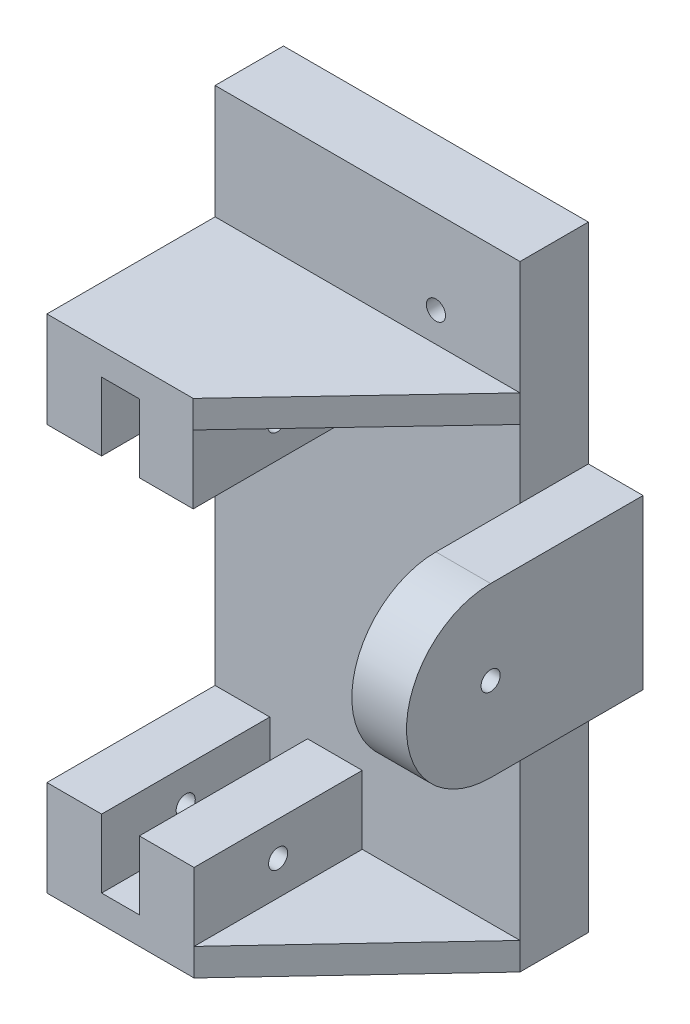
ISO-10303-21;
HEADER;
FILE_DESCRIPTION(('STEP AP214'),'2;1');
FILE_NAME('part.step','',(''),(''),'','','');
FILE_SCHEMA(('AUTOMOTIVE_DESIGN { 1 0 10303 214 1 1 1 1 }'));
ENDSEC;
DATA;
#1=APPLICATION_CONTEXT('core data for automotive mechanical design processes');
#2=APPLICATION_PROTOCOL_DEFINITION('international standard','automotive_design',2000,#1);
#3=PRODUCT_CONTEXT('',#1,'mechanical');
#4=PRODUCT('Part','Part','',(#3));
#5=PRODUCT_RELATED_PRODUCT_CATEGORY('part','',(#4));
#6=PRODUCT_DEFINITION_FORMATION('','',#4);
#7=PRODUCT_DEFINITION_CONTEXT('part definition',#1,'design');
#8=PRODUCT_DEFINITION('design','',#6,#7);
#9=PRODUCT_DEFINITION_SHAPE('','',#8);
#10=(LENGTH_UNIT() NAMED_UNIT(*) SI_UNIT(.MILLI.,.METRE.));
#11=(NAMED_UNIT(*) PLANE_ANGLE_UNIT() SI_UNIT($,.RADIAN.));
#12=(NAMED_UNIT(*) SI_UNIT($,.STERADIAN.) SOLID_ANGLE_UNIT());
#13=UNCERTAINTY_MEASURE_WITH_UNIT(LENGTH_MEASURE(1.E-05),#10,'distance_accuracy_value','');
#14=(GEOMETRIC_REPRESENTATION_CONTEXT(3) GLOBAL_UNCERTAINTY_ASSIGNED_CONTEXT((#13)) GLOBAL_UNIT_ASSIGNED_CONTEXT((#10,
#11,#12)) REPRESENTATION_CONTEXT('',''));
#15=CARTESIAN_POINT('',(0.,0.,0.));
#16=DIRECTION('',(0.,0.,1.));
#17=DIRECTION('',(1.,0.,0.));
#18=AXIS2_PLACEMENT_3D('',#15,#16,#17);
#19=CARTESIAN_POINT('',(0.,0.,5.));
#20=DIRECTION('',(-1.,0.,0.));
#21=DIRECTION('',(0.,-1.,0.));
#22=AXIS2_PLACEMENT_3D('',#19,#20,#21);
#23=PLANE('',#22);
#24=DIRECTION('',(0.,0.,-1.));
#25=VECTOR('',#24,1.);
#26=CARTESIAN_POINT('',(0.,-27.62,0.));
#27=LINE('',#26,#25);
#28=CARTESIAN_POINT('',(0.,-27.62,5.));
#29=VERTEX_POINT('',#28);
#30=CARTESIAN_POINT('',(0.,-27.62,0.));
#31=VERTEX_POINT('',#30);
#32=EDGE_CURVE('E11',#29,#31,#27,.T.);
#33=ORIENTED_EDGE('',*,*,#32,.F.);
#34=DIRECTION('',(0.,1.,0.));
#35=VECTOR('',#34,1.);
#36=CARTESIAN_POINT('',(0.,0.,5.));
#37=LINE('',#36,#35);
#38=CARTESIAN_POINT('',(0.,-43.,5.));
#39=VERTEX_POINT('',#38);
#40=EDGE_CURVE('E513',#39,#29,#37,.T.);
#41=ORIENTED_EDGE('',*,*,#40,.F.);
#42=DIRECTION('',(0.,1.,0.));
#43=VECTOR('',#42,1.);
#44=CARTESIAN_POINT('',(0.,-45.,5.));
#45=LINE('',#44,#43);
#46=CARTESIAN_POINT('',(0.,-45.,5.));
#47=VERTEX_POINT('',#46);
#48=EDGE_CURVE('E396',#47,#39,#45,.T.);
#49=ORIENTED_EDGE('',*,*,#48,.F.);
#50=DIRECTION('',(0.,0.,1.));
#51=VECTOR('',#50,1.);
#52=CARTESIAN_POINT('',(0.,-45.,5.));
#53=LINE('',#52,#51);
#54=CARTESIAN_POINT('',(0.,-45.,0.));
#55=VERTEX_POINT('',#54);
#56=EDGE_CURVE('E398',#55,#47,#53,.T.);
#57=ORIENTED_EDGE('',*,*,#56,.F.);
#58=DIRECTION('',(0.,1.,0.));
#59=VECTOR('',#58,1.);
#60=CARTESIAN_POINT('',(0.,0.,0.));
#61=LINE('',#60,#59);
#62=EDGE_CURVE('E271',#55,#31,#61,.T.);
#63=ORIENTED_EDGE('',*,*,#62,.T.);
#64=EDGE_LOOP('',(#33,#41,#49,#57,#63));
#65=FACE_BOUND('',#64,.T.);
#66=ADVANCED_FACE('F41',(#65),#23,.F.);
#67=DIRECTION('',(0.,0.,1.));
#68=VECTOR('',#67,1.);
#69=CARTESIAN_POINT('',(0.,-15.32,11.15));
#70=LINE('',#69,#68);
#71=CARTESIAN_POINT('',(0.,-15.32,0.));
#72=VERTEX_POINT('',#71);
#73=CARTESIAN_POINT('',(0.,-15.32,5.));
#74=VERTEX_POINT('',#73);
#75=EDGE_CURVE('E63',#72,#74,#70,.T.);
#76=ORIENTED_EDGE('',*,*,#75,.F.);
#77=CARTESIAN_POINT('',(0.,0.,0.));
#78=VERTEX_POINT('',#77);
#79=EDGE_CURVE('E243',#72,#78,#61,.T.);
#80=ORIENTED_EDGE('',*,*,#79,.T.);
#81=DIRECTION('',(0.,0.,-1.));
#82=VECTOR('',#81,1.);
#83=CARTESIAN_POINT('',(0.,0.,5.));
#84=LINE('',#83,#82);
#85=CARTESIAN_POINT('',(0.,0.,5.));
#86=VERTEX_POINT('',#85);
#87=EDGE_CURVE('E49',#86,#78,#84,.T.);
#88=ORIENTED_EDGE('',*,*,#87,.F.);
#89=CARTESIAN_POINT('',(0.,-8.32,5.));
#90=VERTEX_POINT('',#89);
#91=EDGE_CURVE('E284',#90,#86,#37,.T.);
#92=ORIENTED_EDGE('',*,*,#91,.F.);
#93=DIRECTION('',(0.,-1.,0.));
#94=VECTOR('',#93,1.);
#95=CARTESIAN_POINT('',(0.,-8.32,5.));
#96=LINE('',#95,#94);
#97=CARTESIAN_POINT('',(0.,-10.32,5.));
#98=VERTEX_POINT('',#97);
#99=EDGE_CURVE('E553',#90,#98,#96,.T.);
#100=ORIENTED_EDGE('',*,*,#99,.T.);
#101=EDGE_CURVE('E517',#74,#98,#37,.T.);
#102=ORIENTED_EDGE('',*,*,#101,.F.);
#103=EDGE_LOOP('',(#76,#80,#88,#92,#100,#102));
#104=FACE_BOUND('',#103,.T.);
#105=ADVANCED_FACE('F532',(#104),#23,.F.);
#106=CARTESIAN_POINT('',(0.,0.,5.));
#107=DIRECTION('',(0.,0.,-1.));
#108=DIRECTION('',(-1.,0.,0.));
#109=AXIS2_PLACEMENT_3D('',#106,#107,#108);
#110=PLANE('',#109);
#111=DIRECTION('',(-1.,0.,0.));
#112=VECTOR('',#111,1.);
#113=CARTESIAN_POINT('',(0.,-10.32,5.));
#114=LINE('',#113,#112);
#115=CARTESIAN_POINT('',(-15.54,-10.32,5.));
#116=VERTEX_POINT('',#115);
#117=CARTESIAN_POINT('',(-18.3,-10.32,5.));
#118=VERTEX_POINT('',#117);
#119=EDGE_CURVE('E244',#116,#118,#114,.T.);
#120=ORIENTED_EDGE('',*,*,#119,.T.);
#121=DIRECTION('',(0.,1.,0.));
#122=VECTOR('',#121,1.);
#123=CARTESIAN_POINT('',(-18.3,-15.32,5.));
#124=LINE('',#123,#122);
#125=CARTESIAN_POINT('',(-18.3,-15.32,5.));
#126=VERTEX_POINT('',#125);
#127=EDGE_CURVE('E459',#126,#118,#124,.T.);
#128=ORIENTED_EDGE('',*,*,#127,.F.);
#129=DIRECTION('',(1.,0.,0.));
#130=VECTOR('',#129,1.);
#131=CARTESIAN_POINT('',(-22.3,-15.32,5.));
#132=LINE('',#131,#130);
#133=CARTESIAN_POINT('',(-22.3,-15.32,5.));
#134=VERTEX_POINT('',#133);
#135=EDGE_CURVE('E454',#134,#126,#132,.T.);
#136=ORIENTED_EDGE('',*,*,#135,.F.);
#137=DIRECTION('',(0.,-1.,0.));
#138=VECTOR('',#137,1.);
#139=CARTESIAN_POINT('',(-22.3,0.,5.));
#140=LINE('',#139,#138);
#141=CARTESIAN_POINT('',(-22.3,-38.,5.));
#142=VERTEX_POINT('',#141);
#143=EDGE_CURVE('E295',#134,#142,#140,.T.);
#144=ORIENTED_EDGE('',*,*,#143,.T.);
#145=DIRECTION('',(-1.,0.,0.));
#146=VECTOR('',#145,1.);
#147=CARTESIAN_POINT('',(-22.3,-38.,5.));
#148=LINE('',#147,#146);
#149=CARTESIAN_POINT('',(-18.3,-38.,5.));
#150=VERTEX_POINT('',#149);
#151=EDGE_CURVE('E337',#150,#142,#148,.T.);
#152=ORIENTED_EDGE('',*,*,#151,.F.);
#153=DIRECTION('',(0.,1.,0.));
#154=VECTOR('',#153,1.);
#155=CARTESIAN_POINT('',(-18.3,-38.,5.));
#156=LINE('',#155,#154);
#157=CARTESIAN_POINT('',(-18.3,-43.,5.));
#158=VERTEX_POINT('',#157);
#159=EDGE_CURVE('E330',#158,#150,#156,.T.);
#160=ORIENTED_EDGE('',*,*,#159,.F.);
#161=DIRECTION('',(1.,0.,0.));
#162=VECTOR('',#161,1.);
#163=CARTESIAN_POINT('',(0.,-43.,5.));
#164=LINE('',#163,#162);
#165=CARTESIAN_POINT('',(-15.54,-43.,5.));
#166=VERTEX_POINT('',#165);
#167=EDGE_CURVE('E288',#158,#166,#164,.T.);
#168=ORIENTED_EDGE('',*,*,#167,.T.);
#169=DIRECTION('',(0.,-1.,0.));
#170=VECTOR('',#169,1.);
#171=CARTESIAN_POINT('',(-15.54,-43.,5.));
#172=LINE('',#171,#170);
#173=CARTESIAN_POINT('',(-15.54,-38.,5.));
#174=VERTEX_POINT('',#173);
#175=EDGE_CURVE('E476',#174,#166,#172,.T.);
#176=ORIENTED_EDGE('',*,*,#175,.F.);
#177=DIRECTION('',(-1.,0.,0.));
#178=VECTOR('',#177,1.);
#179=CARTESIAN_POINT('',(-15.54,-38.,5.));
#180=LINE('',#179,#178);
#181=CARTESIAN_POINT('',(-11.54,-38.,5.));
#182=VERTEX_POINT('',#181);
#183=EDGE_CURVE('E326',#182,#174,#180,.T.);
#184=ORIENTED_EDGE('',*,*,#183,.F.);
#185=DIRECTION('',(0.,1.,0.));
#186=VECTOR('',#185,1.);
#187=CARTESIAN_POINT('',(-11.54,-43.,5.));
#188=LINE('',#187,#186);
#189=CARTESIAN_POINT('',(-11.54,-43.,5.));
#190=VERTEX_POINT('',#189);
#191=EDGE_CURVE('E482',#190,#182,#188,.T.);
#192=ORIENTED_EDGE('',*,*,#191,.F.);
#193=EDGE_CURVE('E294',#190,#39,#164,.T.);
#194=ORIENTED_EDGE('',*,*,#193,.T.);
#195=ORIENTED_EDGE('',*,*,#40,.T.);
#196=EDGE_CURVE('E516',#29,#74,#37,.T.);
#197=ORIENTED_EDGE('',*,*,#196,.T.);
#198=ORIENTED_EDGE('',*,*,#101,.T.);
#199=CARTESIAN_POINT('',(-11.6,-10.32,5.));
#200=VERTEX_POINT('',#199);
#201=EDGE_CURVE('E247',#98,#200,#114,.T.);
#202=ORIENTED_EDGE('',*,*,#201,.T.);
#203=DIRECTION('',(0.,1.,0.));
#204=VECTOR('',#203,1.);
#205=CARTESIAN_POINT('',(-11.6,-15.32,5.));
#206=LINE('',#205,#204);
#207=CARTESIAN_POINT('',(-11.6,-15.32,5.));
#208=VERTEX_POINT('',#207);
#209=EDGE_CURVE('E431',#208,#200,#206,.T.);
#210=ORIENTED_EDGE('',*,*,#209,.F.);
#211=DIRECTION('',(1.,0.,0.));
#212=VECTOR('',#211,1.);
#213=CARTESIAN_POINT('',(-15.54,-15.32,5.));
#214=LINE('',#213,#212);
#215=CARTESIAN_POINT('',(-15.54,-15.32,5.));
#216=VERTEX_POINT('',#215);
#217=EDGE_CURVE('E439',#216,#208,#214,.T.);
#218=ORIENTED_EDGE('',*,*,#217,.F.);
#219=DIRECTION('',(0.,-1.,0.));
#220=VECTOR('',#219,1.);
#221=CARTESIAN_POINT('',(-15.54,-15.32,5.));
#222=LINE('',#221,#220);
#223=EDGE_CURVE('E426',#116,#216,#222,.T.);
#224=ORIENTED_EDGE('',*,*,#223,.F.);
#225=EDGE_LOOP('',(#120,#128,#136,#144,#152,#160,#168,#176,#184,#192,#194,#195,#197,#198,#202,
#210,#218,#224));
#226=FACE_BOUND('',#225,.T.);
#227=ADVANCED_FACE('F374',(#226),#110,.F.);
#228=CARTESIAN_POINT('',(-6.15,-6.15,5.));
#229=DIRECTION('',(0.,0.,1.));
#230=DIRECTION('',(1.,0.,0.));
#231=AXIS2_PLACEMENT_3D('',#228,#229,#230);
#232=CIRCLE('',#231,0.7);
#233=CARTESIAN_POINT('',(-5.45,-6.15,5.));
#234=VERTEX_POINT('',#233);
#235=EDGE_CURVE('E361',#234,#234,#232,.T.);
#236=ORIENTED_EDGE('',*,*,#235,.F.);
#237=EDGE_LOOP('',(#236));
#238=FACE_BOUND('',#237,.T.);
#239=CARTESIAN_POINT('',(-22.3,0.,5.));
#240=VERTEX_POINT('',#239);
#241=CARTESIAN_POINT('',(-22.3,-8.32,5.));
#242=VERTEX_POINT('',#241);
#243=EDGE_CURVE('E291',#240,#242,#140,.T.);
#244=ORIENTED_EDGE('',*,*,#243,.T.);
#245=DIRECTION('',(-1.,0.,0.));
#246=VECTOR('',#245,1.);
#247=CARTESIAN_POINT('',(0.,-8.32,5.));
#248=LINE('',#247,#246);
#249=EDGE_CURVE('E526',#90,#242,#248,.T.);
#250=ORIENTED_EDGE('',*,*,#249,.F.);
#251=ORIENTED_EDGE('',*,*,#91,.T.);
#252=DIRECTION('',(-1.,0.,0.));
#253=VECTOR('',#252,1.);
#254=CARTESIAN_POINT('',(0.,0.,5.));
#255=LINE('',#254,#253);
#256=EDGE_CURVE('E299',#86,#240,#255,.T.);
#257=ORIENTED_EDGE('',*,*,#256,.T.);
#258=EDGE_LOOP('',(#244,#250,#251,#257));
#259=FACE_BOUND('',#258,.T.);
#260=ADVANCED_FACE('F523',(#238,#259),#110,.F.);
#261=CARTESIAN_POINT('',(-6.15,-6.15,5.));
#262=DIRECTION('',(0.,0.,-1.));
#263=DIRECTION('',(-1.,0.,0.));
#264=AXIS2_PLACEMENT_3D('',#261,#262,#263);
#265=CYLINDRICAL_SURFACE('',#264,2.45);
#266=CARTESIAN_POINT('',(-6.15,-6.15,0.));
#267=DIRECTION('',(0.,0.,1.));
#268=DIRECTION('',(1.,0.,0.));
#269=AXIS2_PLACEMENT_3D('',#266,#267,#268);
#270=CIRCLE('',#269,2.45);
#271=CARTESIAN_POINT('',(-3.7,-6.15,0.));
#272=VERTEX_POINT('',#271);
#273=EDGE_CURVE('E272',#272,#272,#270,.T.);
#274=ORIENTED_EDGE('',*,*,#273,.F.);
#275=EDGE_LOOP('',(#274));
#276=FACE_BOUND('',#275,.T.);
#277=CARTESIAN_POINT('',(-6.15,-6.15,2.53));
#278=DIRECTION('',(0.,0.,1.));
#279=DIRECTION('',(1.,0.,0.));
#280=AXIS2_PLACEMENT_3D('',#277,#278,#279);
#281=CIRCLE('',#280,2.45);
#282=CARTESIAN_POINT('',(-3.7,-6.15,2.53));
#283=VERTEX_POINT('',#282);
#284=EDGE_CURVE('E982',#283,#283,#281,.T.);
#285=ORIENTED_EDGE('',*,*,#284,.T.);
#286=EDGE_LOOP('',(#285));
#287=FACE_BOUND('',#286,.T.);
#288=ADVANCED_FACE('F621',(#276,#287),#265,.F.);
#289=CARTESIAN_POINT('',(0.,0.,0.));
#290=DIRECTION('',(0.,0.,-1.));
#291=DIRECTION('',(-1.,0.,0.));
#292=AXIS2_PLACEMENT_3D('',#289,#290,#291);
#293=PLANE('',#292);
#294=ORIENTED_EDGE('',*,*,#62,.F.);
#295=DIRECTION('',(1.,0.,0.));
#296=VECTOR('',#295,1.);
#297=CARTESIAN_POINT('',(0.,-45.,0.));
#298=LINE('',#297,#296);
#299=CARTESIAN_POINT('',(-22.3,-45.,0.));
#300=VERTEX_POINT('',#299);
#301=EDGE_CURVE('E560',#300,#55,#298,.T.);
#302=ORIENTED_EDGE('',*,*,#301,.F.);
#303=DIRECTION('',(0.,-1.,0.));
#304=VECTOR('',#303,1.);
#305=CARTESIAN_POINT('',(-22.3,0.,0.));
#306=LINE('',#305,#304);
#307=CARTESIAN_POINT('',(-22.3,0.,0.));
#308=VERTEX_POINT('',#307);
#309=EDGE_CURVE('E282',#308,#300,#306,.T.);
#310=ORIENTED_EDGE('',*,*,#309,.F.);
#311=DIRECTION('',(-1.,0.,0.));
#312=VECTOR('',#311,1.);
#313=CARTESIAN_POINT('',(0.,0.,0.));
#314=LINE('',#313,#312);
#315=EDGE_CURVE('E279',#78,#308,#314,.T.);
#316=ORIENTED_EDGE('',*,*,#315,.F.);
#317=ORIENTED_EDGE('',*,*,#79,.F.);
#318=DIRECTION('',(-1.,0.,0.));
#319=VECTOR('',#318,1.);
#320=CARTESIAN_POINT('',(4.,-15.32,0.));
#321=LINE('',#320,#319);
#322=CARTESIAN_POINT('',(4.,-15.32,0.));
#323=VERTEX_POINT('',#322);
#324=EDGE_CURVE('E222',#323,#72,#321,.T.);
#325=ORIENTED_EDGE('',*,*,#324,.F.);
#326=DIRECTION('',(0.,1.,0.));
#327=VECTOR('',#326,1.);
#328=CARTESIAN_POINT('',(4.,-15.32,0.));
#329=LINE('',#328,#327);
#330=CARTESIAN_POINT('',(4.,-27.62,0.));
#331=VERTEX_POINT('',#330);
#332=EDGE_CURVE('E228',#331,#323,#329,.T.);
#333=ORIENTED_EDGE('',*,*,#332,.F.);
#334=DIRECTION('',(-1.,0.,0.));
#335=VECTOR('',#334,1.);
#336=CARTESIAN_POINT('',(4.,-27.62,0.));
#337=LINE('',#336,#335);
#338=EDGE_CURVE('E255',#331,#31,#337,.T.);
#339=ORIENTED_EDGE('',*,*,#338,.T.);
#340=EDGE_LOOP('',(#294,#302,#310,#316,#317,#325,#333,#339));
#341=FACE_BOUND('',#340,.T.);
#342=ORIENTED_EDGE('',*,*,#273,.T.);
#343=EDGE_LOOP('',(#342));
#344=FACE_BOUND('',#343,.T.);
#345=ADVANCED_FACE('F240',(#341,#344),#293,.T.);
#346=CARTESIAN_POINT('',(0.,0.,5.));
#347=DIRECTION('',(0.,-1.,0.));
#348=DIRECTION('',(0.,0.,-1.));
#349=AXIS2_PLACEMENT_3D('',#346,#347,#348);
#350=PLANE('',#349);
#351=ORIENTED_EDGE('',*,*,#315,.T.);
#352=DIRECTION('',(0.,0.,-1.));
#353=VECTOR('',#352,1.);
#354=CARTESIAN_POINT('',(-22.3,0.,5.));
#355=LINE('',#354,#353);
#356=EDGE_CURVE('E285',#240,#308,#355,.T.);
#357=ORIENTED_EDGE('',*,*,#356,.F.);
#358=ORIENTED_EDGE('',*,*,#256,.F.);
#359=ORIENTED_EDGE('',*,*,#87,.T.);
#360=EDGE_LOOP('',(#351,#357,#358,#359));
#361=FACE_BOUND('',#360,.T.);
#362=ADVANCED_FACE('F530',(#361),#350,.F.);
#363=CARTESIAN_POINT('',(-22.3,0.,5.));
#364=DIRECTION('',(1.,0.,0.));
#365=DIRECTION('',(0.,1.,0.));
#366=AXIS2_PLACEMENT_3D('',#363,#364,#365);
#367=PLANE('',#366);
#368=CARTESIAN_POINT('',(-22.3,-40.5,11.15));
#369=DIRECTION('',(-1.,0.,0.));
#370=DIRECTION('',(0.,-1.,0.));
#371=AXIS2_PLACEMENT_3D('',#368,#369,#370);
#372=CIRCLE('',#371,0.699999999999999);
#373=CARTESIAN_POINT('',(-22.3,-41.2,11.15));
#374=VERTEX_POINT('',#373);
#375=EDGE_CURVE('E315',#374,#374,#372,.T.);
#376=ORIENTED_EDGE('',*,*,#375,.F.);
#377=EDGE_LOOP('',(#376));
#378=FACE_BOUND('',#377,.T.);
#379=CARTESIAN_POINT('',(-22.3,-12.82,11.15));
#380=DIRECTION('',(-1.,0.,0.));
#381=DIRECTION('',(0.,-1.,0.));
#382=AXIS2_PLACEMENT_3D('',#379,#380,#381);
#383=CIRCLE('',#382,0.699999999999999);
#384=CARTESIAN_POINT('',(-22.3,-13.52,11.15));
#385=VERTEX_POINT('',#384);
#386=EDGE_CURVE('E310',#385,#385,#383,.T.);
#387=ORIENTED_EDGE('',*,*,#386,.F.);
#388=EDGE_LOOP('',(#387));
#389=FACE_BOUND('',#388,.T.);
#390=ORIENTED_EDGE('',*,*,#309,.T.);
#391=DIRECTION('',(0.,0.,-1.));
#392=VECTOR('',#391,1.);
#393=CARTESIAN_POINT('',(-22.3,-45.,0.));
#394=LINE('',#393,#392);
#395=CARTESIAN_POINT('',(-22.3,-45.,17.3));
#396=VERTEX_POINT('',#395);
#397=EDGE_CURVE('E381',#396,#300,#394,.T.);
#398=ORIENTED_EDGE('',*,*,#397,.F.);
#399=DIRECTION('',(0.,-1.,0.));
#400=VECTOR('',#399,1.);
#401=CARTESIAN_POINT('',(-22.3,-38.,17.3));
#402=LINE('',#401,#400);
#403=CARTESIAN_POINT('',(-22.3,-38.,17.3));
#404=VERTEX_POINT('',#403);
#405=EDGE_CURVE('E319',#404,#396,#402,.T.);
#406=ORIENTED_EDGE('',*,*,#405,.F.);
#407=DIRECTION('',(0.,0.,-1.));
#408=VECTOR('',#407,1.);
#409=CARTESIAN_POINT('',(-22.3,-38.,17.3));
#410=LINE('',#409,#408);
#411=EDGE_CURVE('E339',#404,#142,#410,.T.);
#412=ORIENTED_EDGE('',*,*,#411,.T.);
#413=ORIENTED_EDGE('',*,*,#143,.F.);
#414=DIRECTION('',(0.,0.,-1.));
#415=VECTOR('',#414,1.);
#416=CARTESIAN_POINT('',(-22.3,-15.32,17.3));
#417=LINE('',#416,#415);
#418=CARTESIAN_POINT('',(-22.3,-15.32,17.3));
#419=VERTEX_POINT('',#418);
#420=EDGE_CURVE('E473',#419,#134,#417,.T.);
#421=ORIENTED_EDGE('',*,*,#420,.F.);
#422=DIRECTION('',(0.,-1.,0.));
#423=VECTOR('',#422,1.);
#424=CARTESIAN_POINT('',(-22.3,-15.32,17.3));
#425=LINE('',#424,#423);
#426=CARTESIAN_POINT('',(-22.3,-8.32,17.3));
#427=VERTEX_POINT('',#426);
#428=EDGE_CURVE('E455',#427,#419,#425,.T.);
#429=ORIENTED_EDGE('',*,*,#428,.F.);
#430=DIRECTION('',(0.,0.,1.));
#431=VECTOR('',#430,1.);
#432=CARTESIAN_POINT('',(-22.3,-8.32,5.));
#433=LINE('',#432,#431);
#434=EDGE_CURVE('E536',#242,#427,#433,.T.);
#435=ORIENTED_EDGE('',*,*,#434,.F.);
#436=ORIENTED_EDGE('',*,*,#243,.F.);
#437=ORIENTED_EDGE('',*,*,#356,.T.);
#438=EDGE_LOOP('',(#390,#398,#406,#412,#413,#421,#429,#435,#436,#437));
#439=FACE_BOUND('',#438,.T.);
#440=ADVANCED_FACE('F379',(#378,#389,#439),#367,.F.);
#441=CARTESIAN_POINT('',(-6.15,-6.15,2.53));
#442=DIRECTION('',(0.,0.,1.));
#443=DIRECTION('',(1.,0.,0.));
#444=AXIS2_PLACEMENT_3D('',#441,#442,#443);
#445=PLANE('',#444);
#446=CARTESIAN_POINT('',(-6.15,-6.15,2.53));
#447=DIRECTION('',(0.,0.,1.));
#448=DIRECTION('',(1.,0.,0.));
#449=AXIS2_PLACEMENT_3D('',#446,#447,#448);
#450=CIRCLE('',#449,0.7);
#451=CARTESIAN_POINT('',(-5.45,-6.15,2.53));
#452=VERTEX_POINT('',#451);
#453=EDGE_CURVE('E366',#452,#452,#450,.T.);
#454=ORIENTED_EDGE('',*,*,#453,.T.);
#455=EDGE_LOOP('',(#454));
#456=FACE_BOUND('',#455,.T.);
#457=ORIENTED_EDGE('',*,*,#284,.F.);
#458=EDGE_LOOP('',(#457));
#459=FACE_BOUND('',#458,.T.);
#460=ADVANCED_FACE('F629',(#456,#459),#445,.F.);
#461=CARTESIAN_POINT('',(-6.15,-6.15,2.53));
#462=DIRECTION('',(0.,0.,1.));
#463=DIRECTION('',(1.,0.,0.));
#464=AXIS2_PLACEMENT_3D('',#461,#462,#463);
#465=CYLINDRICAL_SURFACE('',#464,0.7);
#466=ORIENTED_EDGE('',*,*,#453,.F.);
#467=EDGE_LOOP('',(#466));
#468=FACE_BOUND('',#467,.T.);
#469=ORIENTED_EDGE('',*,*,#235,.T.);
#470=EDGE_LOOP('',(#469));
#471=FACE_BOUND('',#470,.T.);
#472=ADVANCED_FACE('F650',(#468,#471),#465,.F.);
#473=CARTESIAN_POINT('',(-18.3,-38.,17.3));
#474=DIRECTION('',(-1.,0.,0.));
#475=DIRECTION('',(0.,0.,1.));
#476=AXIS2_PLACEMENT_3D('',#473,#474,#475);
#477=PLANE('',#476);
#478=CARTESIAN_POINT('',(-18.3,-40.5,11.15));
#479=DIRECTION('',(-1.,0.,0.));
#480=DIRECTION('',(0.,0.,1.));
#481=AXIS2_PLACEMENT_3D('',#478,#479,#480);
#482=CIRCLE('',#481,0.699999999999999);
#483=CARTESIAN_POINT('',(-18.3,-40.5,11.85));
#484=VERTEX_POINT('',#483);
#485=EDGE_CURVE('E416',#484,#484,#482,.T.);
#486=ORIENTED_EDGE('',*,*,#485,.T.);
#487=EDGE_LOOP('',(#486));
#488=FACE_BOUND('',#487,.T.);
#489=ORIENTED_EDGE('',*,*,#159,.T.);
#490=DIRECTION('',(0.,0.,-1.));
#491=VECTOR('',#490,1.);
#492=CARTESIAN_POINT('',(-18.3,-38.,17.3));
#493=LINE('',#492,#491);
#494=CARTESIAN_POINT('',(-18.3,-38.,17.3));
#495=VERTEX_POINT('',#494);
#496=EDGE_CURVE('E342',#495,#150,#493,.T.);
#497=ORIENTED_EDGE('',*,*,#496,.F.);
#498=DIRECTION('',(0.,1.,0.));
#499=VECTOR('',#498,1.);
#500=CARTESIAN_POINT('',(-18.3,-38.,17.3));
#501=LINE('',#500,#499);
#502=CARTESIAN_POINT('',(-18.3,-43.,17.3));
#503=VERTEX_POINT('',#502);
#504=EDGE_CURVE('E316',#503,#495,#501,.T.);
#505=ORIENTED_EDGE('',*,*,#504,.F.);
#506=DIRECTION('',(0.,0.,-1.));
#507=VECTOR('',#506,1.);
#508=CARTESIAN_POINT('',(-18.3,-43.,17.3));
#509=LINE('',#508,#507);
#510=EDGE_CURVE('E356',#503,#158,#509,.T.);
#511=ORIENTED_EDGE('',*,*,#510,.T.);
#512=EDGE_LOOP('',(#489,#497,#505,#511));
#513=FACE_BOUND('',#512,.T.);
#514=ADVANCED_FACE('F371',(#488,#513),#477,.F.);
#515=CARTESIAN_POINT('',(-22.3,-38.,17.3));
#516=DIRECTION('',(0.,-1.,0.));
#517=DIRECTION('',(0.,0.,-1.));
#518=AXIS2_PLACEMENT_3D('',#515,#516,#517);
#519=PLANE('',#518);
#520=ORIENTED_EDGE('',*,*,#151,.T.);
#521=ORIENTED_EDGE('',*,*,#411,.F.);
#522=DIRECTION('',(-1.,0.,0.));
#523=VECTOR('',#522,1.);
#524=CARTESIAN_POINT('',(-22.3,-38.,17.3));
#525=LINE('',#524,#523);
#526=EDGE_CURVE('E318',#495,#404,#525,.T.);
#527=ORIENTED_EDGE('',*,*,#526,.F.);
#528=ORIENTED_EDGE('',*,*,#496,.T.);
#529=EDGE_LOOP('',(#520,#521,#527,#528));
#530=FACE_BOUND('',#529,.T.);
#531=ADVANCED_FACE('F377',(#530),#519,.F.);
#532=CARTESIAN_POINT('',(0.,0.,17.3));
#533=DIRECTION('',(0.,0.,1.));
#534=DIRECTION('',(1.,0.,0.));
#535=AXIS2_PLACEMENT_3D('',#532,#533,#534);
#536=PLANE('',#535);
#537=ORIENTED_EDGE('',*,*,#405,.T.);
#538=DIRECTION('',(-1.,0.,0.));
#539=VECTOR('',#538,1.);
#540=CARTESIAN_POINT('',(-22.3,-45.,17.3));
#541=LINE('',#540,#539);
#542=CARTESIAN_POINT('',(-11.54,-45.,17.3));
#543=VERTEX_POINT('',#542);
#544=EDGE_CURVE('E387',#543,#396,#541,.T.);
#545=ORIENTED_EDGE('',*,*,#544,.F.);
#546=DIRECTION('',(0.,1.,0.));
#547=VECTOR('',#546,1.);
#548=CARTESIAN_POINT('',(-11.54,-45.,17.3));
#549=LINE('',#548,#547);
#550=CARTESIAN_POINT('',(-11.54,-43.,17.3));
#551=VERTEX_POINT('',#550);
#552=EDGE_CURVE('E394',#543,#551,#549,.T.);
#553=ORIENTED_EDGE('',*,*,#552,.T.);
#554=DIRECTION('',(0.,1.,0.));
#555=VECTOR('',#554,1.);
#556=CARTESIAN_POINT('',(-11.54,-43.,17.3));
#557=LINE('',#556,#555);
#558=CARTESIAN_POINT('',(-11.54,-38.,17.3));
#559=VERTEX_POINT('',#558);
#560=EDGE_CURVE('E325',#551,#559,#557,.T.);
#561=ORIENTED_EDGE('',*,*,#560,.T.);
#562=DIRECTION('',(-1.,0.,0.));
#563=VECTOR('',#562,1.);
#564=CARTESIAN_POINT('',(-15.54,-38.,17.3));
#565=LINE('',#564,#563);
#566=CARTESIAN_POINT('',(-15.54,-38.,17.3));
#567=VERTEX_POINT('',#566);
#568=EDGE_CURVE('E478',#559,#567,#565,.T.);
#569=ORIENTED_EDGE('',*,*,#568,.T.);
#570=DIRECTION('',(0.,-1.,0.));
#571=VECTOR('',#570,1.);
#572=CARTESIAN_POINT('',(-15.54,-43.,17.3));
#573=LINE('',#572,#571);
#574=CARTESIAN_POINT('',(-15.54,-43.,17.3));
#575=VERTEX_POINT('',#574);
#576=EDGE_CURVE('E322',#567,#575,#573,.T.);
#577=ORIENTED_EDGE('',*,*,#576,.T.);
#578=DIRECTION('',(-1.,0.,0.));
#579=VECTOR('',#578,1.);
#580=CARTESIAN_POINT('',(-22.3,-43.,17.3));
#581=LINE('',#580,#579);
#582=EDGE_CURVE('E405',#575,#503,#581,.T.);
#583=ORIENTED_EDGE('',*,*,#582,.T.);
#584=ORIENTED_EDGE('',*,*,#504,.T.);
#585=ORIENTED_EDGE('',*,*,#526,.T.);
#586=EDGE_LOOP('',(#537,#545,#553,#561,#569,#577,#583,#584,#585));
#587=FACE_BOUND('',#586,.T.);
#588=ADVANCED_FACE('F385',(#587),#536,.T.);
#589=CARTESIAN_POINT('',(-15.54,-43.,17.3));
#590=DIRECTION('',(1.,0.,0.));
#591=DIRECTION('',(0.,0.,-1.));
#592=AXIS2_PLACEMENT_3D('',#589,#590,#591);
#593=PLANE('',#592);
#594=CARTESIAN_POINT('',(-15.54,-40.5,11.15));
#595=DIRECTION('',(1.,0.,0.));
#596=DIRECTION('',(0.,0.,-1.));
#597=AXIS2_PLACEMENT_3D('',#594,#595,#596);
#598=CIRCLE('',#597,0.699999999999999);
#599=CARTESIAN_POINT('',(-15.54,-40.5,10.45));
#600=VERTEX_POINT('',#599);
#601=EDGE_CURVE('E314',#600,#600,#598,.T.);
#602=ORIENTED_EDGE('',*,*,#601,.T.);
#603=EDGE_LOOP('',(#602));
#604=FACE_BOUND('',#603,.T.);
#605=ORIENTED_EDGE('',*,*,#175,.T.);
#606=DIRECTION('',(0.,0.,-1.));
#607=VECTOR('',#606,1.);
#608=CARTESIAN_POINT('',(-15.54,-43.,17.3));
#609=LINE('',#608,#607);
#610=EDGE_CURVE('E328',#575,#166,#609,.T.);
#611=ORIENTED_EDGE('',*,*,#610,.F.);
#612=ORIENTED_EDGE('',*,*,#576,.F.);
#613=DIRECTION('',(0.,0.,-1.));
#614=VECTOR('',#613,1.);
#615=CARTESIAN_POINT('',(-15.54,-38.,17.3));
#616=LINE('',#615,#614);
#617=EDGE_CURVE('E480',#567,#174,#616,.T.);
#618=ORIENTED_EDGE('',*,*,#617,.T.);
#619=EDGE_LOOP('',(#605,#611,#612,#618));
#620=FACE_BOUND('',#619,.T.);
#621=ADVANCED_FACE('F510',(#604,#620),#593,.F.);
#622=CARTESIAN_POINT('',(-11.54,-43.,17.3));
#623=DIRECTION('',(-1.,0.,0.));
#624=DIRECTION('',(0.,0.,1.));
#625=AXIS2_PLACEMENT_3D('',#622,#623,#624);
#626=PLANE('',#625);
#627=CARTESIAN_POINT('',(-11.54,-40.5,11.15));
#628=DIRECTION('',(-1.,0.,0.));
#629=DIRECTION('',(0.,0.,1.));
#630=AXIS2_PLACEMENT_3D('',#627,#628,#629);
#631=CIRCLE('',#630,0.699999999999999);
#632=CARTESIAN_POINT('',(-11.54,-40.5,11.85));
#633=VERTEX_POINT('',#632);
#634=EDGE_CURVE('E311',#633,#633,#631,.T.);
#635=ORIENTED_EDGE('',*,*,#634,.T.);
#636=EDGE_LOOP('',(#635));
#637=FACE_BOUND('',#636,.T.);
#638=ORIENTED_EDGE('',*,*,#191,.T.);
#639=DIRECTION('',(0.,0.,-1.));
#640=VECTOR('',#639,1.);
#641=CARTESIAN_POINT('',(-11.54,-38.,17.3));
#642=LINE('',#641,#640);
#643=EDGE_CURVE('E488',#559,#182,#642,.T.);
#644=ORIENTED_EDGE('',*,*,#643,.F.);
#645=ORIENTED_EDGE('',*,*,#560,.F.);
#646=DIRECTION('',(0.,0.,-1.));
#647=VECTOR('',#646,1.);
#648=CARTESIAN_POINT('',(-11.54,-43.,17.3));
#649=LINE('',#648,#647);
#650=EDGE_CURVE('E331',#551,#190,#649,.T.);
#651=ORIENTED_EDGE('',*,*,#650,.T.);
#652=EDGE_LOOP('',(#638,#644,#645,#651));
#653=FACE_BOUND('',#652,.T.);
#654=ADVANCED_FACE('F496',(#637,#653),#626,.F.);
#655=CARTESIAN_POINT('',(-15.54,-38.,17.3));
#656=DIRECTION('',(0.,-1.,0.));
#657=DIRECTION('',(1.,0.,0.));
#658=AXIS2_PLACEMENT_3D('',#655,#656,#657);
#659=PLANE('',#658);
#660=ORIENTED_EDGE('',*,*,#183,.T.);
#661=ORIENTED_EDGE('',*,*,#617,.F.);
#662=ORIENTED_EDGE('',*,*,#568,.F.);
#663=ORIENTED_EDGE('',*,*,#643,.T.);
#664=EDGE_LOOP('',(#660,#661,#662,#663));
#665=FACE_BOUND('',#664,.T.);
#666=ADVANCED_FACE('F506',(#665),#659,.F.);
#667=CARTESIAN_POINT('',(-22.3,-15.32,17.3));
#668=DIRECTION('',(0.,1.,0.));
#669=DIRECTION('',(0.,0.,1.));
#670=AXIS2_PLACEMENT_3D('',#667,#668,#669);
#671=PLANE('',#670);
#672=ORIENTED_EDGE('',*,*,#135,.T.);
#673=DIRECTION('',(0.,0.,-1.));
#674=VECTOR('',#673,1.);
#675=CARTESIAN_POINT('',(-18.3,-15.32,17.3));
#676=LINE('',#675,#674);
#677=CARTESIAN_POINT('',(-18.3,-15.32,17.3));
#678=VERTEX_POINT('',#677);
#679=EDGE_CURVE('E470',#678,#126,#676,.T.);
#680=ORIENTED_EDGE('',*,*,#679,.F.);
#681=DIRECTION('',(1.,0.,0.));
#682=VECTOR('',#681,1.);
#683=CARTESIAN_POINT('',(-22.3,-15.32,17.3));
#684=LINE('',#683,#682);
#685=EDGE_CURVE('E458',#419,#678,#684,.T.);
#686=ORIENTED_EDGE('',*,*,#685,.F.);
#687=ORIENTED_EDGE('',*,*,#420,.T.);
#688=EDGE_LOOP('',(#672,#680,#686,#687));
#689=FACE_BOUND('',#688,.T.);
#690=ADVANCED_FACE('F597',(#689),#671,.F.);
#691=CARTESIAN_POINT('',(-18.3,-15.32,17.3));
#692=DIRECTION('',(-1.,0.,0.));
#693=DIRECTION('',(0.,0.,1.));
#694=AXIS2_PLACEMENT_3D('',#691,#692,#693);
#695=PLANE('',#694);
#696=CARTESIAN_POINT('',(-18.3,-12.82,11.15));
#697=DIRECTION('',(-1.,0.,0.));
#698=DIRECTION('',(0.,0.,1.));
#699=AXIS2_PLACEMENT_3D('',#696,#697,#698);
#700=CIRCLE('',#699,0.699999999999999);
#701=CARTESIAN_POINT('',(-18.3,-12.82,11.85));
#702=VERTEX_POINT('',#701);
#703=EDGE_CURVE('E423',#702,#702,#700,.T.);
#704=ORIENTED_EDGE('',*,*,#703,.T.);
#705=EDGE_LOOP('',(#704));
#706=FACE_BOUND('',#705,.T.);
#707=ORIENTED_EDGE('',*,*,#127,.T.);
#708=DIRECTION('',(0.,0.,-1.));
#709=VECTOR('',#708,1.);
#710=CARTESIAN_POINT('',(-18.3,-10.32,17.3));
#711=LINE('',#710,#709);
#712=CARTESIAN_POINT('',(-18.3,-10.32,17.3));
#713=VERTEX_POINT('',#712);
#714=EDGE_CURVE('E464',#713,#118,#711,.T.);
#715=ORIENTED_EDGE('',*,*,#714,.F.);
#716=DIRECTION('',(0.,1.,0.));
#717=VECTOR('',#716,1.);
#718=CARTESIAN_POINT('',(-18.3,-15.32,17.3));
#719=LINE('',#718,#717);
#720=EDGE_CURVE('E461',#678,#713,#719,.T.);
#721=ORIENTED_EDGE('',*,*,#720,.F.);
#722=ORIENTED_EDGE('',*,*,#679,.T.);
#723=EDGE_LOOP('',(#707,#715,#721,#722));
#724=FACE_BOUND('',#723,.T.);
#725=ADVANCED_FACE('F594',(#706,#724),#695,.F.);
#726=CARTESIAN_POINT('',(0.,0.,17.3));
#727=DIRECTION('',(0.,0.,-1.));
#728=DIRECTION('',(-1.,0.,0.));
#729=AXIS2_PLACEMENT_3D('',#726,#727,#728);
#730=PLANE('',#729);
#731=ORIENTED_EDGE('',*,*,#428,.T.);
#732=ORIENTED_EDGE('',*,*,#685,.T.);
#733=ORIENTED_EDGE('',*,*,#720,.T.);
#734=DIRECTION('',(1.,0.,0.));
#735=VECTOR('',#734,1.);
#736=CARTESIAN_POINT('',(-22.3,-10.32,17.3));
#737=LINE('',#736,#735);
#738=CARTESIAN_POINT('',(-15.54,-10.32,17.3));
#739=VERTEX_POINT('',#738);
#740=EDGE_CURVE('E549',#713,#739,#737,.T.);
#741=ORIENTED_EDGE('',*,*,#740,.T.);
#742=DIRECTION('',(0.,-1.,0.));
#743=VECTOR('',#742,1.);
#744=CARTESIAN_POINT('',(-15.54,-15.32,17.3));
#745=LINE('',#744,#743);
#746=CARTESIAN_POINT('',(-15.54,-15.32,17.3));
#747=VERTEX_POINT('',#746);
#748=EDGE_CURVE('E427',#739,#747,#745,.T.);
#749=ORIENTED_EDGE('',*,*,#748,.T.);
#750=DIRECTION('',(1.,0.,0.));
#751=VECTOR('',#750,1.);
#752=CARTESIAN_POINT('',(-15.54,-15.32,17.3));
#753=LINE('',#752,#751);
#754=CARTESIAN_POINT('',(-11.6,-15.32,17.3));
#755=VERTEX_POINT('',#754);
#756=EDGE_CURVE('E430',#747,#755,#753,.T.);
#757=ORIENTED_EDGE('',*,*,#756,.T.);
#758=DIRECTION('',(0.,1.,0.));
#759=VECTOR('',#758,1.);
#760=CARTESIAN_POINT('',(-11.6,-15.32,17.3));
#761=LINE('',#760,#759);
#762=CARTESIAN_POINT('',(-11.6,-10.32,17.3));
#763=VERTEX_POINT('',#762);
#764=EDGE_CURVE('E433',#755,#763,#761,.T.);
#765=ORIENTED_EDGE('',*,*,#764,.T.);
#766=DIRECTION('',(0.,-1.,0.));
#767=VECTOR('',#766,1.);
#768=CARTESIAN_POINT('',(-11.6,-8.32,17.3));
#769=LINE('',#768,#767);
#770=CARTESIAN_POINT('',(-11.6,-8.32,17.3));
#771=VERTEX_POINT('',#770);
#772=EDGE_CURVE('E406',#771,#763,#769,.T.);
#773=ORIENTED_EDGE('',*,*,#772,.F.);
#774=DIRECTION('',(1.,0.,0.));
#775=VECTOR('',#774,1.);
#776=CARTESIAN_POINT('',(-22.3,-8.32,17.3));
#777=LINE('',#776,#775);
#778=EDGE_CURVE('E540',#427,#771,#777,.T.);
#779=ORIENTED_EDGE('',*,*,#778,.F.);
#780=EDGE_LOOP('',(#731,#732,#733,#741,#749,#757,#765,#773,#779));
#781=FACE_BOUND('',#780,.T.);
#782=ADVANCED_FACE('F599',(#781),#730,.F.);
#783=CARTESIAN_POINT('',(-15.54,-15.32,17.3));
#784=DIRECTION('',(1.,0.,0.));
#785=DIRECTION('',(0.,0.,-1.));
#786=AXIS2_PLACEMENT_3D('',#783,#784,#785);
#787=PLANE('',#786);
#788=CARTESIAN_POINT('',(-15.54,-12.82,11.15));
#789=DIRECTION('',(1.,0.,0.));
#790=DIRECTION('',(0.,0.,-1.));
#791=AXIS2_PLACEMENT_3D('',#788,#789,#790);
#792=CIRCLE('',#791,0.699999999999999);
#793=CARTESIAN_POINT('',(-15.54,-12.82,10.45));
#794=VERTEX_POINT('',#793);
#795=EDGE_CURVE('E309',#794,#794,#792,.T.);
#796=ORIENTED_EDGE('',*,*,#795,.T.);
#797=EDGE_LOOP('',(#796));
#798=FACE_BOUND('',#797,.T.);
#799=ORIENTED_EDGE('',*,*,#223,.T.);
#800=DIRECTION('',(0.,0.,-1.));
#801=VECTOR('',#800,1.);
#802=CARTESIAN_POINT('',(-15.54,-15.32,17.3));
#803=LINE('',#802,#801);
#804=EDGE_CURVE('E451',#747,#216,#803,.T.);
#805=ORIENTED_EDGE('',*,*,#804,.F.);
#806=ORIENTED_EDGE('',*,*,#748,.F.);
#807=DIRECTION('',(0.,0.,-1.));
#808=VECTOR('',#807,1.);
#809=CARTESIAN_POINT('',(-15.54,-10.32,17.3));
#810=LINE('',#809,#808);
#811=EDGE_CURVE('E436',#739,#116,#810,.T.);
#812=ORIENTED_EDGE('',*,*,#811,.T.);
#813=EDGE_LOOP('',(#799,#805,#806,#812));
#814=FACE_BOUND('',#813,.T.);
#815=ADVANCED_FACE('F588',(#798,#814),#787,.F.);
#816=CARTESIAN_POINT('',(-15.54,-15.32,17.3));
#817=DIRECTION('',(0.,1.,0.));
#818=DIRECTION('',(0.,0.,1.));
#819=AXIS2_PLACEMENT_3D('',#816,#817,#818);
#820=PLANE('',#819);
#821=ORIENTED_EDGE('',*,*,#217,.T.);
#822=DIRECTION('',(0.,0.,-1.));
#823=VECTOR('',#822,1.);
#824=CARTESIAN_POINT('',(-11.6,-15.32,17.3));
#825=LINE('',#824,#823);
#826=EDGE_CURVE('E448',#755,#208,#825,.T.);
#827=ORIENTED_EDGE('',*,*,#826,.F.);
#828=ORIENTED_EDGE('',*,*,#756,.F.);
#829=ORIENTED_EDGE('',*,*,#804,.T.);
#830=EDGE_LOOP('',(#821,#827,#828,#829));
#831=FACE_BOUND('',#830,.T.);
#832=ADVANCED_FACE('F582',(#831),#820,.F.);
#833=CARTESIAN_POINT('',(-11.6,-15.32,17.3));
#834=DIRECTION('',(-1.,0.,0.));
#835=DIRECTION('',(0.,0.,1.));
#836=AXIS2_PLACEMENT_3D('',#833,#834,#835);
#837=PLANE('',#836);
#838=CARTESIAN_POINT('',(-11.6,-12.82,11.15));
#839=DIRECTION('',(-1.,0.,0.));
#840=DIRECTION('',(0.,0.,1.));
#841=AXIS2_PLACEMENT_3D('',#838,#839,#840);
#842=CIRCLE('',#841,0.699999999999999);
#843=CARTESIAN_POINT('',(-11.6,-12.82,11.85));
#844=VERTEX_POINT('',#843);
#845=EDGE_CURVE('E306',#844,#844,#842,.T.);
#846=ORIENTED_EDGE('',*,*,#845,.T.);
#847=EDGE_LOOP('',(#846));
#848=FACE_BOUND('',#847,.T.);
#849=ORIENTED_EDGE('',*,*,#209,.T.);
#850=DIRECTION('',(0.,0.,-1.));
#851=VECTOR('',#850,1.);
#852=CARTESIAN_POINT('',(-11.6,-10.32,17.3));
#853=LINE('',#852,#851);
#854=EDGE_CURVE('E446',#763,#200,#853,.T.);
#855=ORIENTED_EDGE('',*,*,#854,.F.);
#856=ORIENTED_EDGE('',*,*,#764,.F.);
#857=ORIENTED_EDGE('',*,*,#826,.T.);
#858=EDGE_LOOP('',(#849,#855,#856,#857));
#859=FACE_BOUND('',#858,.T.);
#860=ADVANCED_FACE('F578',(#848,#859),#837,.F.);
#861=CARTESIAN_POINT('',(0.,-12.82,11.15));
#862=DIRECTION('',(-1.,0.,0.));
#863=DIRECTION('',(0.,-1.,0.));
#864=AXIS2_PLACEMENT_3D('',#861,#862,#863);
#865=CYLINDRICAL_SURFACE('',#864,0.699999999999999);
#866=ORIENTED_EDGE('',*,*,#845,.F.);
#867=EDGE_LOOP('',(#866));
#868=FACE_BOUND('',#867,.T.);
#869=ORIENTED_EDGE('',*,*,#795,.F.);
#870=EDGE_LOOP('',(#869));
#871=FACE_BOUND('',#870,.T.);
#872=ADVANCED_FACE('F733',(#868,#871),#865,.F.);
#873=ORIENTED_EDGE('',*,*,#386,.T.);
#874=EDGE_LOOP('',(#873));
#875=FACE_BOUND('',#874,.T.);
#876=ORIENTED_EDGE('',*,*,#703,.F.);
#877=EDGE_LOOP('',(#876));
#878=FACE_BOUND('',#877,.T.);
#879=ADVANCED_FACE('F857',(#875,#878),#865,.F.);
#880=CARTESIAN_POINT('',(0.,-40.5,11.15));
#881=DIRECTION('',(-1.,0.,0.));
#882=DIRECTION('',(0.,-1.,0.));
#883=AXIS2_PLACEMENT_3D('',#880,#881,#882);
#884=CYLINDRICAL_SURFACE('',#883,0.699999999999999);
#885=ORIENTED_EDGE('',*,*,#634,.F.);
#886=EDGE_LOOP('',(#885));
#887=FACE_BOUND('',#886,.T.);
#888=ORIENTED_EDGE('',*,*,#601,.F.);
#889=EDGE_LOOP('',(#888));
#890=FACE_BOUND('',#889,.T.);
#891=ADVANCED_FACE('F855',(#887,#890),#884,.F.);
#892=ORIENTED_EDGE('',*,*,#375,.T.);
#893=EDGE_LOOP('',(#892));
#894=FACE_BOUND('',#893,.T.);
#895=ORIENTED_EDGE('',*,*,#485,.F.);
#896=EDGE_LOOP('',(#895));
#897=FACE_BOUND('',#896,.T.);
#898=ADVANCED_FACE('F852',(#894,#897),#884,.F.);
#899=CARTESIAN_POINT('',(0.,-43.,0.));
#900=DIRECTION('',(0.,1.,0.));
#901=DIRECTION('',(0.,0.,1.));
#902=AXIS2_PLACEMENT_3D('',#899,#900,#901);
#903=PLANE('',#902);
#904=ORIENTED_EDGE('',*,*,#193,.F.);
#905=ORIENTED_EDGE('',*,*,#650,.F.);
#906=DIRECTION('',(-0.684217195605232,0.,0.729278293409389));
#907=VECTOR('',#906,1.);
#908=CARTESIAN_POINT('',(-11.54,-43.,17.3));
#909=LINE('',#908,#907);
#910=EDGE_CURVE('E402',#39,#551,#909,.T.);
#911=ORIENTED_EDGE('',*,*,#910,.F.);
#912=EDGE_LOOP('',(#904,#905,#911));
#913=FACE_BOUND('',#912,.T.);
#914=ADVANCED_FACE('F500',(#913),#903,.T.);
#915=CARTESIAN_POINT('',(-11.54,-45.,17.3));
#916=DIRECTION('',(-0.729278293409389,0.,-0.684217195605232));
#917=DIRECTION('',(-0.684217195605232,0.,0.729278293409389));
#918=AXIS2_PLACEMENT_3D('',#915,#916,#917);
#919=PLANE('',#918);
#920=ORIENTED_EDGE('',*,*,#910,.T.);
#921=ORIENTED_EDGE('',*,*,#552,.F.);
#922=DIRECTION('',(-0.684217195605232,0.,0.729278293409389));
#923=VECTOR('',#922,1.);
#924=CARTESIAN_POINT('',(-11.54,-45.,17.3));
#925=LINE('',#924,#923);
#926=EDGE_CURVE('E392',#47,#543,#925,.T.);
#927=ORIENTED_EDGE('',*,*,#926,.F.);
#928=ORIENTED_EDGE('',*,*,#48,.T.);
#929=EDGE_LOOP('',(#920,#921,#927,#928));
#930=FACE_BOUND('',#929,.T.);
#931=ADVANCED_FACE('F503',(#930),#919,.F.);
#932=CARTESIAN_POINT('',(0.,-45.,0.));
#933=DIRECTION('',(0.,1.,0.));
#934=DIRECTION('',(0.,0.,1.));
#935=AXIS2_PLACEMENT_3D('',#932,#933,#934);
#936=PLANE('',#935);
#937=ORIENTED_EDGE('',*,*,#397,.T.);
#938=ORIENTED_EDGE('',*,*,#301,.T.);
#939=ORIENTED_EDGE('',*,*,#56,.T.);
#940=ORIENTED_EDGE('',*,*,#926,.T.);
#941=ORIENTED_EDGE('',*,*,#544,.T.);
#942=EDGE_LOOP('',(#937,#938,#939,#940,#941));
#943=FACE_BOUND('',#942,.T.);
#944=ADVANCED_FACE('F389',(#943),#936,.F.);
#945=ORIENTED_EDGE('',*,*,#582,.F.);
#946=ORIENTED_EDGE('',*,*,#610,.T.);
#947=ORIENTED_EDGE('',*,*,#167,.F.);
#948=ORIENTED_EDGE('',*,*,#510,.F.);
#949=EDGE_LOOP('',(#945,#946,#947,#948));
#950=FACE_BOUND('',#949,.T.);
#951=ADVANCED_FACE('F512',(#950),#903,.T.);
#952=CARTESIAN_POINT('',(0.,-10.32,0.));
#953=DIRECTION('',(0.,1.,0.));
#954=DIRECTION('',(0.,0.,1.));
#955=AXIS2_PLACEMENT_3D('',#952,#953,#954);
#956=PLANE('',#955);
#957=ORIENTED_EDGE('',*,*,#740,.F.);
#958=ORIENTED_EDGE('',*,*,#714,.T.);
#959=ORIENTED_EDGE('',*,*,#119,.F.);
#960=ORIENTED_EDGE('',*,*,#811,.F.);
#961=EDGE_LOOP('',(#957,#958,#959,#960));
#962=FACE_BOUND('',#961,.T.);
#963=ADVANCED_FACE('F590',(#962),#956,.F.);
#964=DIRECTION('',(0.686102324883031,0.,-0.727505051384593));
#965=VECTOR('',#964,1.);
#966=CARTESIAN_POINT('',(-11.6,-10.32,17.3));
#967=LINE('',#966,#965);
#968=EDGE_CURVE('E546',#763,#98,#967,.T.);
#969=ORIENTED_EDGE('',*,*,#968,.F.);
#970=ORIENTED_EDGE('',*,*,#854,.T.);
#971=ORIENTED_EDGE('',*,*,#201,.F.);
#972=EDGE_LOOP('',(#969,#970,#971));
#973=FACE_BOUND('',#972,.T.);
#974=ADVANCED_FACE('F575',(#973),#956,.F.);
#975=CARTESIAN_POINT('',(-11.6,-8.32,17.3));
#976=DIRECTION('',(-0.727505051384593,0.,-0.686102324883031));
#977=DIRECTION('',(-0.686102324883031,0.,0.727505051384593));
#978=AXIS2_PLACEMENT_3D('',#975,#976,#977);
#979=PLANE('',#978);
#980=ORIENTED_EDGE('',*,*,#968,.T.);
#981=ORIENTED_EDGE('',*,*,#99,.F.);
#982=DIRECTION('',(0.686102324883031,0.,-0.727505051384593));
#983=VECTOR('',#982,1.);
#984=CARTESIAN_POINT('',(-11.6,-8.32,17.3));
#985=LINE('',#984,#983);
#986=EDGE_CURVE('E544',#771,#90,#985,.T.);
#987=ORIENTED_EDGE('',*,*,#986,.F.);
#988=ORIENTED_EDGE('',*,*,#772,.T.);
#989=EDGE_LOOP('',(#980,#981,#987,#988));
#990=FACE_BOUND('',#989,.T.);
#991=ADVANCED_FACE('F570',(#990),#979,.F.);
#992=CARTESIAN_POINT('',(0.,-8.32,0.));
#993=DIRECTION('',(0.,1.,0.));
#994=DIRECTION('',(0.,0.,1.));
#995=AXIS2_PLACEMENT_3D('',#992,#993,#994);
#996=PLANE('',#995);
#997=ORIENTED_EDGE('',*,*,#249,.T.);
#998=ORIENTED_EDGE('',*,*,#434,.T.);
#999=ORIENTED_EDGE('',*,*,#778,.T.);
#1000=ORIENTED_EDGE('',*,*,#986,.T.);
#1001=EDGE_LOOP('',(#997,#998,#999,#1000));
#1002=FACE_BOUND('',#1001,.T.);
#1003=ADVANCED_FACE('F542',(#1002),#996,.T.);
#1004=CARTESIAN_POINT('',(0.,-21.47,11.15));
#1005=DIRECTION('',(-1.,0.,0.));
#1006=DIRECTION('',(0.,-1.,0.));
#1007=AXIS2_PLACEMENT_3D('',#1004,#1005,#1006);
#1008=PLANE('',#1007);
#1009=CARTESIAN_POINT('',(0.,-21.47,11.15));
#1010=DIRECTION('',(1.,0.,0.));
#1011=DIRECTION('',(0.,1.,0.));
#1012=AXIS2_PLACEMENT_3D('',#1009,#1010,#1011);
#1013=CIRCLE('',#1012,0.699999999999999);
#1014=CARTESIAN_POINT('',(0.,-20.77,11.15));
#1015=VERTEX_POINT('',#1014);
#1016=EDGE_CURVE('E1007',#1015,#1015,#1013,.T.);
#1017=ORIENTED_EDGE('',*,*,#1016,.T.);
#1018=EDGE_LOOP('',(#1017));
#1019=FACE_BOUND('',#1018,.T.);
#1020=ORIENTED_EDGE('',*,*,#196,.F.);
#1021=CARTESIAN_POINT('',(0.,-27.62,11.15));
#1022=VERTEX_POINT('',#1021);
#1023=EDGE_CURVE('E238',#1022,#29,#27,.T.);
#1024=ORIENTED_EDGE('',*,*,#1023,.F.);
#1025=CARTESIAN_POINT('',(0.,-21.47,11.15));
#1026=DIRECTION('',(1.,0.,0.));
#1027=DIRECTION('',(0.,-1.,0.));
#1028=AXIS2_PLACEMENT_3D('',#1025,#1026,#1027);
#1029=CIRCLE('',#1028,6.15);
#1030=CARTESIAN_POINT('',(0.,-15.32,11.15));
#1031=VERTEX_POINT('',#1030);
#1032=EDGE_CURVE('E264',#1031,#1022,#1029,.T.);
#1033=ORIENTED_EDGE('',*,*,#1032,.F.);
#1034=EDGE_CURVE('E260',#74,#1031,#70,.T.);
#1035=ORIENTED_EDGE('',*,*,#1034,.F.);
#1036=EDGE_LOOP('',(#1020,#1024,#1033,#1035));
#1037=FACE_BOUND('',#1036,.T.);
#1038=ADVANCED_FACE('F567',(#1019,#1037),#1008,.T.);
#1039=CARTESIAN_POINT('',(4.,-21.47,11.15));
#1040=DIRECTION('',(-1.,0.,0.));
#1041=DIRECTION('',(0.,-1.,0.));
#1042=AXIS2_PLACEMENT_3D('',#1039,#1040,#1041);
#1043=PLANE('',#1042);
#1044=ORIENTED_EDGE('',*,*,#332,.T.);
#1045=DIRECTION('',(0.,0.,1.));
#1046=VECTOR('',#1045,1.);
#1047=CARTESIAN_POINT('',(4.,-15.32,11.15));
#1048=LINE('',#1047,#1046);
#1049=CARTESIAN_POINT('',(4.,-15.32,11.15));
#1050=VERTEX_POINT('',#1049);
#1051=EDGE_CURVE('E218',#323,#1050,#1048,.T.);
#1052=ORIENTED_EDGE('',*,*,#1051,.T.);
#1053=CARTESIAN_POINT('',(4.,-21.47,11.15));
#1054=DIRECTION('',(1.,0.,0.));
#1055=DIRECTION('',(0.,-1.,0.));
#1056=AXIS2_PLACEMENT_3D('',#1053,#1054,#1055);
#1057=CIRCLE('',#1056,6.15);
#1058=CARTESIAN_POINT('',(4.,-27.62,11.15));
#1059=VERTEX_POINT('',#1058);
#1060=EDGE_CURVE('E227',#1050,#1059,#1057,.T.);
#1061=ORIENTED_EDGE('',*,*,#1060,.T.);
#1062=DIRECTION('',(0.,0.,-1.));
#1063=VECTOR('',#1062,1.);
#1064=CARTESIAN_POINT('',(4.,-27.62,0.));
#1065=LINE('',#1064,#1063);
#1066=EDGE_CURVE('E234',#1059,#331,#1065,.T.);
#1067=ORIENTED_EDGE('',*,*,#1066,.T.);
#1068=EDGE_LOOP('',(#1044,#1052,#1061,#1067));
#1069=FACE_BOUND('',#1068,.T.);
#1070=CARTESIAN_POINT('',(4.,-21.47,11.15));
#1071=DIRECTION('',(1.,0.,0.));
#1072=DIRECTION('',(0.,1.,0.));
#1073=AXIS2_PLACEMENT_3D('',#1070,#1071,#1072);
#1074=CIRCLE('',#1073,0.699999999999999);
#1075=CARTESIAN_POINT('',(4.,-20.77,11.15));
#1076=VERTEX_POINT('',#1075);
#1077=EDGE_CURVE('E263',#1076,#1076,#1074,.T.);
#1078=ORIENTED_EDGE('',*,*,#1077,.F.);
#1079=EDGE_LOOP('',(#1078));
#1080=FACE_BOUND('',#1079,.T.);
#1081=ADVANCED_FACE('F231',(#1069,#1080),#1043,.F.);
#1082=CARTESIAN_POINT('',(4.,-15.32,11.15));
#1083=DIRECTION('',(0.,-1.,0.));
#1084=DIRECTION('',(1.,0.,0.));
#1085=AXIS2_PLACEMENT_3D('',#1082,#1083,#1084);
#1086=PLANE('',#1085);
#1087=ORIENTED_EDGE('',*,*,#75,.T.);
#1088=ORIENTED_EDGE('',*,*,#1034,.T.);
#1089=DIRECTION('',(-1.,0.,0.));
#1090=VECTOR('',#1089,1.);
#1091=CARTESIAN_POINT('',(4.,-15.32,11.15));
#1092=LINE('',#1091,#1090);
#1093=EDGE_CURVE('E224',#1050,#1031,#1092,.T.);
#1094=ORIENTED_EDGE('',*,*,#1093,.F.);
#1095=ORIENTED_EDGE('',*,*,#1051,.F.);
#1096=ORIENTED_EDGE('',*,*,#324,.T.);
#1097=EDGE_LOOP('',(#1087,#1088,#1094,#1095,#1096));
#1098=FACE_BOUND('',#1097,.T.);
#1099=ADVANCED_FACE('F220',(#1098),#1086,.F.);
#1100=CARTESIAN_POINT('',(4.,-21.47,11.15));
#1101=DIRECTION('',(-1.,0.,0.));
#1102=DIRECTION('',(0.,-1.,0.));
#1103=AXIS2_PLACEMENT_3D('',#1100,#1101,#1102);
#1104=CYLINDRICAL_SURFACE('',#1103,6.15);
#1105=ORIENTED_EDGE('',*,*,#1032,.T.);
#1106=DIRECTION('',(-1.,0.,0.));
#1107=VECTOR('',#1106,1.);
#1108=CARTESIAN_POINT('',(4.,-27.62,11.15));
#1109=LINE('',#1108,#1107);
#1110=EDGE_CURVE('E249',#1059,#1022,#1109,.T.);
#1111=ORIENTED_EDGE('',*,*,#1110,.F.);
#1112=ORIENTED_EDGE('',*,*,#1060,.F.);
#1113=ORIENTED_EDGE('',*,*,#1093,.T.);
#1114=EDGE_LOOP('',(#1105,#1111,#1112,#1113));
#1115=FACE_BOUND('',#1114,.T.);
#1116=ADVANCED_FACE('F813',(#1115),#1104,.T.);
#1117=CARTESIAN_POINT('',(4.,-27.62,0.));
#1118=DIRECTION('',(0.,1.,0.));
#1119=DIRECTION('',(-1.,0.,0.));
#1120=AXIS2_PLACEMENT_3D('',#1117,#1118,#1119);
#1121=PLANE('',#1120);
#1122=ORIENTED_EDGE('',*,*,#1023,.T.);
#1123=ORIENTED_EDGE('',*,*,#32,.T.);
#1124=ORIENTED_EDGE('',*,*,#338,.F.);
#1125=ORIENTED_EDGE('',*,*,#1066,.F.);
#1126=ORIENTED_EDGE('',*,*,#1110,.T.);
#1127=EDGE_LOOP('',(#1122,#1123,#1124,#1125,#1126));
#1128=FACE_BOUND('',#1127,.T.);
#1129=ADVANCED_FACE('F562',(#1128),#1121,.F.);
#1130=CARTESIAN_POINT('',(4.,-21.47,11.15));
#1131=DIRECTION('',(-1.,0.,0.));
#1132=DIRECTION('',(0.,-1.,0.));
#1133=AXIS2_PLACEMENT_3D('',#1130,#1131,#1132);
#1134=CYLINDRICAL_SURFACE('',#1133,0.699999999999999);
#1135=ORIENTED_EDGE('',*,*,#1077,.T.);
#1136=EDGE_LOOP('',(#1135));
#1137=FACE_BOUND('',#1136,.T.);
#1138=ORIENTED_EDGE('',*,*,#1016,.F.);
#1139=EDGE_LOOP('',(#1138));
#1140=FACE_BOUND('',#1139,.T.);
#1141=ADVANCED_FACE('F831',(#1137,#1140),#1134,.F.);
#1142=CLOSED_SHELL('',(#66,#105,#227,#260,#288,#345,#362,#440,#460,#472,#514,#531,#588,#621,
#654,#666,#690,#725,#782,#815,#832,#860,#872,#879,#891,#898,#914,#931,#944,#951,#963,#974,#991,
#1003,#1038,#1081,#1099,#1116,#1129,#1141));
#1143=MANIFOLD_SOLID_BREP('B2',#1142);
#1144=ADVANCED_BREP_SHAPE_REPRESENTATION('',(#18,#1143),#14);
#1145=SHAPE_DEFINITION_REPRESENTATION(#9,#1144);
ENDSEC;
END-ISO-10303-21;
